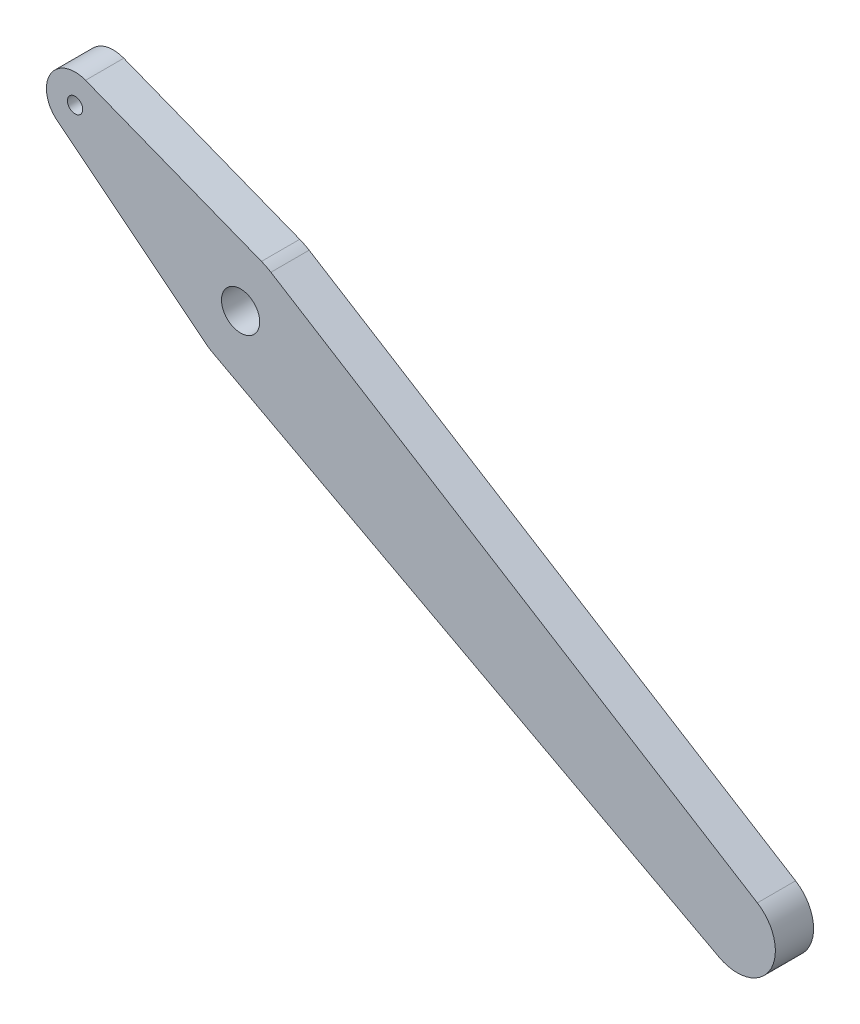
ISO-10303-21;
HEADER;
FILE_DESCRIPTION(('STEP AP214'),'2;1');
FILE_NAME('part.step','',(''),(''),'','','');
FILE_SCHEMA(('AUTOMOTIVE_DESIGN { 1 0 10303 214 1 1 1 1 }'));
ENDSEC;
DATA;
#1=APPLICATION_CONTEXT('core data for automotive mechanical design processes');
#2=APPLICATION_PROTOCOL_DEFINITION('international standard','automotive_design',2000,#1);
#3=PRODUCT_CONTEXT('',#1,'mechanical');
#4=PRODUCT('Part','Part','',(#3));
#5=PRODUCT_RELATED_PRODUCT_CATEGORY('part','',(#4));
#6=PRODUCT_DEFINITION_FORMATION('','',#4);
#7=PRODUCT_DEFINITION_CONTEXT('part definition',#1,'design');
#8=PRODUCT_DEFINITION('design','',#6,#7);
#9=PRODUCT_DEFINITION_SHAPE('','',#8);
#10=(LENGTH_UNIT() NAMED_UNIT(*) SI_UNIT(.MILLI.,.METRE.));
#11=(NAMED_UNIT(*) PLANE_ANGLE_UNIT() SI_UNIT($,.RADIAN.));
#12=(NAMED_UNIT(*) SI_UNIT($,.STERADIAN.) SOLID_ANGLE_UNIT());
#13=UNCERTAINTY_MEASURE_WITH_UNIT(LENGTH_MEASURE(1.E-05),#10,'distance_accuracy_value','');
#14=(GEOMETRIC_REPRESENTATION_CONTEXT(3) GLOBAL_UNCERTAINTY_ASSIGNED_CONTEXT((#13)) GLOBAL_UNIT_ASSIGNED_CONTEXT((#10,
#11,#12)) REPRESENTATION_CONTEXT('',''));
#15=CARTESIAN_POINT('',(0.,0.,0.));
#16=DIRECTION('',(0.,0.,1.));
#17=DIRECTION('',(1.,0.,0.));
#18=AXIS2_PLACEMENT_3D('',#15,#16,#17);
#19=CARTESIAN_POINT('',(-43.3012701892221,24.9999999999997,5.));
#20=DIRECTION('',(0.,0.,-1.));
#21=DIRECTION('',(-1.,0.,0.));
#22=AXIS2_PLACEMENT_3D('',#19,#20,#21);
#23=CYLINDRICAL_SURFACE('',#22,7.5);
#24=CARTESIAN_POINT('',(-43.3012701892221,24.9999999999997,-5.));
#25=DIRECTION('',(0.,0.,1.));
#26=DIRECTION('',(1.,0.,0.));
#27=AXIS2_PLACEMENT_3D('',#24,#25,#26);
#28=CIRCLE('',#27,7.5);
#29=CARTESIAN_POINT('',(-40.5679762809887,31.9842039210786,-5.));
#30=VERTEX_POINT('',#29);
#31=CARTESIAN_POINT('',(-47.9831212559705,19.1407960789208,-5.));
#32=VERTEX_POINT('',#31);
#33=EDGE_CURVE('E131',#30,#32,#28,.T.);
#34=ORIENTED_EDGE('',*,*,#33,.T.);
#35=DIRECTION('',(0.,0.,-1.));
#36=VECTOR('',#35,1.);
#37=CARTESIAN_POINT('',(-47.9831212559705,19.1407960789208,5.));
#38=LINE('',#37,#36);
#39=CARTESIAN_POINT('',(-47.9831212559705,19.1407960789208,5.));
#40=VERTEX_POINT('',#39);
#41=EDGE_CURVE('E11',#40,#32,#38,.T.);
#42=ORIENTED_EDGE('',*,*,#41,.F.);
#43=CARTESIAN_POINT('',(-43.3012701892221,24.9999999999997,5.));
#44=DIRECTION('',(0.,0.,1.));
#45=DIRECTION('',(1.,0.,0.));
#46=AXIS2_PLACEMENT_3D('',#43,#44,#45);
#47=CIRCLE('',#46,7.5);
#48=CARTESIAN_POINT('',(-40.5679762809887,31.9842039210786,5.));
#49=VERTEX_POINT('',#48);
#50=EDGE_CURVE('E148',#49,#40,#47,.T.);
#51=ORIENTED_EDGE('',*,*,#50,.F.);
#52=DIRECTION('',(0.,0.,-1.));
#53=VECTOR('',#52,1.);
#54=CARTESIAN_POINT('',(-40.5679762809887,31.9842039210786,5.));
#55=LINE('',#54,#53);
#56=EDGE_CURVE('E48',#49,#30,#55,.T.);
#57=ORIENTED_EDGE('',*,*,#56,.T.);
#58=EDGE_LOOP('',(#34,#42,#51,#57));
#59=FACE_BOUND('',#58,.T.);
#60=ADVANCED_FACE('F32',(#59),#23,.T.);
#61=CARTESIAN_POINT('',(-9.36370213349686,-11.7184078421578,5.));
#62=DIRECTION('',(0.624246808899791,0.781227189477189,0.));
#63=DIRECTION('',(-0.781227189477189,0.624246808899791,0.));
#64=AXIS2_PLACEMENT_3D('',#61,#62,#63);
#65=PLANE('',#64);
#66=DIRECTION('',(0.781227189477189,-0.624246808899791,0.));
#67=VECTOR('',#66,1.);
#68=CARTESIAN_POINT('',(-9.36370213349686,-11.7184078421578,-5.));
#69=LINE('',#68,#67);
#70=CARTESIAN_POINT('',(-9.36370213349686,-11.7184078421578,-5.));
#71=VERTEX_POINT('',#70);
#72=EDGE_CURVE('E133',#32,#71,#69,.T.);
#73=ORIENTED_EDGE('',*,*,#72,.T.);
#74=DIRECTION('',(0.,0.,-1.));
#75=VECTOR('',#74,1.);
#76=CARTESIAN_POINT('',(-9.36370213349686,-11.7184078421578,5.));
#77=LINE('',#76,#75);
#78=CARTESIAN_POINT('',(-9.36370213349686,-11.7184078421578,5.));
#79=VERTEX_POINT('',#78);
#80=EDGE_CURVE('E40',#79,#71,#77,.T.);
#81=ORIENTED_EDGE('',*,*,#80,.F.);
#82=DIRECTION('',(0.781227189477189,-0.624246808899791,0.));
#83=VECTOR('',#82,1.);
#84=CARTESIAN_POINT('',(-9.36370213349686,-11.7184078421578,5.));
#85=LINE('',#84,#83);
#86=EDGE_CURVE('E87',#40,#79,#85,.T.);
#87=ORIENTED_EDGE('',*,*,#86,.F.);
#88=ORIENTED_EDGE('',*,*,#41,.T.);
#89=EDGE_LOOP('',(#73,#81,#87,#88));
#90=FACE_BOUND('',#89,.T.);
#91=ADVANCED_FACE('F185',(#90),#65,.F.);
#92=CARTESIAN_POINT('',(0.,0.,5.));
#93=DIRECTION('',(0.,0.,-1.));
#94=DIRECTION('',(-1.,0.,0.));
#95=AXIS2_PLACEMENT_3D('',#92,#93,#94);
#96=CYLINDRICAL_SURFACE('',#95,15.);
#97=CARTESIAN_POINT('',(0.,0.,-5.));
#98=DIRECTION('',(0.,0.,1.));
#99=DIRECTION('',(1.,0.,0.));
#100=AXIS2_PLACEMENT_3D('',#97,#98,#99);
#101=CIRCLE('',#100,15.);
#102=CARTESIAN_POINT('',(-7.06281947339017,-13.2331621725988,-5.));
#103=VERTEX_POINT('',#102);
#104=EDGE_CURVE('E136',#71,#103,#101,.T.);
#105=ORIENTED_EDGE('',*,*,#104,.T.);
#106=DIRECTION('',(0.,0.,-1.));
#107=VECTOR('',#106,1.);
#108=CARTESIAN_POINT('',(-7.06281947339017,-13.2331621725988,5.));
#109=LINE('',#108,#107);
#110=CARTESIAN_POINT('',(-7.06281947339017,-13.2331621725988,5.));
#111=VERTEX_POINT('',#110);
#112=EDGE_CURVE('E155',#111,#103,#109,.T.);
#113=ORIENTED_EDGE('',*,*,#112,.F.);
#114=CARTESIAN_POINT('',(0.,0.,5.));
#115=DIRECTION('',(0.,0.,1.));
#116=DIRECTION('',(1.,0.,0.));
#117=AXIS2_PLACEMENT_3D('',#114,#115,#116);
#118=CIRCLE('',#117,15.);
#119=EDGE_CURVE('E120',#79,#111,#118,.T.);
#120=ORIENTED_EDGE('',*,*,#119,.F.);
#121=ORIENTED_EDGE('',*,*,#80,.T.);
#122=EDGE_LOOP('',(#105,#113,#120,#121));
#123=FACE_BOUND('',#122,.T.);
#124=ADVANCED_FACE('F161',(#123),#96,.T.);
#125=CARTESIAN_POINT('',(-7.06281947339017,-13.2331621725988,5.));
#126=DIRECTION('',(0.470854631559345,0.882210811506589,0.));
#127=DIRECTION('',(-0.882210811506589,0.470854631559345,0.));
#128=AXIS2_PLACEMENT_3D('',#125,#126,#127);
#129=PLANE('',#128);
#130=DIRECTION('',(0.882210811506589,-0.470854631559345,0.));
#131=VECTOR('',#130,1.);
#132=CARTESIAN_POINT('',(-7.06281947339017,-13.2331621725988,-5.));
#133=LINE('',#132,#131);
#134=CARTESIAN_POINT('',(125.195264252073,-83.8221081150649,-5.));
#135=VERTEX_POINT('',#134);
#136=EDGE_CURVE('E138',#103,#135,#133,.T.);
#137=ORIENTED_EDGE('',*,*,#136,.T.);
#138=DIRECTION('',(0.,0.,-1.));
#139=VECTOR('',#138,1.);
#140=CARTESIAN_POINT('',(125.195264252073,-83.8221081150649,5.));
#141=LINE('',#140,#139);
#142=CARTESIAN_POINT('',(125.195264252073,-83.8221081150649,5.));
#143=VERTEX_POINT('',#142);
#144=EDGE_CURVE('E152',#143,#135,#141,.T.);
#145=ORIENTED_EDGE('',*,*,#144,.F.);
#146=DIRECTION('',(0.882210811506589,-0.470854631559345,0.));
#147=VECTOR('',#146,1.);
#148=CARTESIAN_POINT('',(-7.06281947339017,-13.2331621725988,5.));
#149=LINE('',#148,#147);
#150=EDGE_CURVE('E126',#111,#143,#149,.T.);
#151=ORIENTED_EDGE('',*,*,#150,.F.);
#152=ORIENTED_EDGE('',*,*,#112,.T.);
#153=EDGE_LOOP('',(#137,#145,#151,#152));
#154=FACE_BOUND('',#153,.T.);
#155=ADVANCED_FACE('F169',(#154),#129,.F.);
#156=CARTESIAN_POINT('',(129.903810567666,-74.9999999999992,5.));
#157=DIRECTION('',(0.,0.,-1.));
#158=DIRECTION('',(-1.,0.,0.));
#159=AXIS2_PLACEMENT_3D('',#156,#157,#158);
#160=CYLINDRICAL_SURFACE('',#159,9.99999999999969);
#161=CARTESIAN_POINT('',(129.903810567666,-74.9999999999992,-5.));
#162=DIRECTION('',(0.,0.,1.));
#163=DIRECTION('',(1.,0.,0.));
#164=AXIS2_PLACEMENT_3D('',#161,#162,#163);
#165=CIRCLE('',#164,9.99999999999969);
#166=CARTESIAN_POINT('',(135.189707152449,-66.5112252182668,-5.));
#167=VERTEX_POINT('',#166);
#168=EDGE_CURVE('E141',#135,#167,#165,.T.);
#169=ORIENTED_EDGE('',*,*,#168,.T.);
#170=DIRECTION('',(0.,0.,-1.));
#171=VECTOR('',#170,1.);
#172=CARTESIAN_POINT('',(135.189707152449,-66.5112252182668,5.));
#173=LINE('',#172,#171);
#174=CARTESIAN_POINT('',(135.189707152449,-66.5112252182668,5.));
#175=VERTEX_POINT('',#174);
#176=EDGE_CURVE('E112',#175,#167,#173,.T.);
#177=ORIENTED_EDGE('',*,*,#176,.F.);
#178=CARTESIAN_POINT('',(129.903810567666,-74.9999999999992,5.));
#179=DIRECTION('',(0.,0.,1.));
#180=DIRECTION('',(1.,0.,0.));
#181=AXIS2_PLACEMENT_3D('',#178,#179,#180);
#182=CIRCLE('',#181,9.99999999999969);
#183=EDGE_CURVE('E123',#143,#175,#182,.T.);
#184=ORIENTED_EDGE('',*,*,#183,.F.);
#185=ORIENTED_EDGE('',*,*,#144,.T.);
#186=EDGE_LOOP('',(#169,#177,#184,#185));
#187=FACE_BOUND('',#186,.T.);
#188=ADVANCED_FACE('F172',(#187),#160,.T.);
#189=CARTESIAN_POINT('',(7.92884487717462,12.7331621725988,5.));
#190=DIRECTION('',(0.528589658478308,0.848877478173256,0.));
#191=DIRECTION('',(-0.848877478173256,0.528589658478308,0.));
#192=AXIS2_PLACEMENT_3D('',#189,#190,#191);
#193=PLANE('',#192);
#194=DIRECTION('',(0.848877478173256,-0.528589658478308,0.));
#195=VECTOR('',#194,1.);
#196=CARTESIAN_POINT('',(7.92884487717462,12.7331621725988,-5.));
#197=LINE('',#196,#195);
#198=CARTESIAN_POINT('',(7.92884487717462,12.7331621725988,-5.));
#199=VERTEX_POINT('',#198);
#200=EDGE_CURVE('E109',#199,#167,#197,.T.);
#201=ORIENTED_EDGE('',*,*,#200,.F.);
#202=DIRECTION('',(0.,0.,-1.));
#203=VECTOR('',#202,1.);
#204=CARTESIAN_POINT('',(7.92884487717462,12.7331621725988,5.));
#205=LINE('',#204,#203);
#206=CARTESIAN_POINT('',(7.92884487717462,12.7331621725988,5.));
#207=VERTEX_POINT('',#206);
#208=EDGE_CURVE('E103',#207,#199,#205,.T.);
#209=ORIENTED_EDGE('',*,*,#208,.F.);
#210=DIRECTION('',(0.848877478173256,-0.528589658478308,0.));
#211=VECTOR('',#210,1.);
#212=CARTESIAN_POINT('',(7.92884487717462,12.7331621725988,5.));
#213=LINE('',#212,#211);
#214=EDGE_CURVE('E107',#207,#175,#213,.T.);
#215=ORIENTED_EDGE('',*,*,#214,.T.);
#216=ORIENTED_EDGE('',*,*,#176,.T.);
#217=EDGE_LOOP('',(#201,#209,#215,#216));
#218=FACE_BOUND('',#217,.T.);
#219=ADVANCED_FACE('F105',(#218),#193,.T.);
#220=CARTESIAN_POINT('',(5.46658781646687,13.9684078421578,-5.));
#221=VERTEX_POINT('',#220);
#222=EDGE_CURVE('E139',#199,#221,#101,.T.);
#223=ORIENTED_EDGE('',*,*,#222,.T.);
#224=DIRECTION('',(0.,0.,-1.));
#225=VECTOR('',#224,1.);
#226=CARTESIAN_POINT('',(5.46658781646687,13.9684078421578,5.));
#227=LINE('',#226,#225);
#228=CARTESIAN_POINT('',(5.46658781646687,13.9684078421578,5.));
#229=VERTEX_POINT('',#228);
#230=EDGE_CURVE('E75',#229,#221,#227,.T.);
#231=ORIENTED_EDGE('',*,*,#230,.F.);
#232=EDGE_CURVE('E114',#207,#229,#118,.T.);
#233=ORIENTED_EDGE('',*,*,#232,.F.);
#234=ORIENTED_EDGE('',*,*,#208,.T.);
#235=EDGE_LOOP('',(#223,#231,#233,#234));
#236=FACE_BOUND('',#235,.T.);
#237=ADVANCED_FACE('F115',(#236),#96,.T.);
#238=CARTESIAN_POINT('',(5.46658781646687,13.9684078421578,5.));
#239=DIRECTION('',(0.364439187764458,0.931227189477188,0.));
#240=DIRECTION('',(-0.931227189477188,0.364439187764458,0.));
#241=AXIS2_PLACEMENT_3D('',#238,#239,#240);
#242=PLANE('',#241);
#243=DIRECTION('',(0.931227189477188,-0.364439187764458,0.));
#244=VECTOR('',#243,1.);
#245=CARTESIAN_POINT('',(5.46658781646687,13.9684078421578,-5.));
#246=LINE('',#245,#244);
#247=EDGE_CURVE('E145',#30,#221,#246,.T.);
#248=ORIENTED_EDGE('',*,*,#247,.F.);
#249=ORIENTED_EDGE('',*,*,#56,.F.);
#250=DIRECTION('',(0.931227189477188,-0.364439187764458,0.));
#251=VECTOR('',#250,1.);
#252=CARTESIAN_POINT('',(5.46658781646687,13.9684078421578,5.));
#253=LINE('',#252,#251);
#254=EDGE_CURVE('E118',#49,#229,#253,.T.);
#255=ORIENTED_EDGE('',*,*,#254,.T.);
#256=ORIENTED_EDGE('',*,*,#230,.T.);
#257=EDGE_LOOP('',(#248,#249,#255,#256));
#258=FACE_BOUND('',#257,.T.);
#259=ADVANCED_FACE('F173',(#258),#242,.T.);
#260=CARTESIAN_POINT('',(0.,0.,5.));
#261=DIRECTION('',(0.,0.,1.));
#262=DIRECTION('',(1.,0.,0.));
#263=AXIS2_PLACEMENT_3D('',#260,#261,#262);
#264=PLANE('',#263);
#265=CARTESIAN_POINT('',(-43.3012701892221,24.9999999999997,5.));
#266=DIRECTION('',(0.,0.,1.));
#267=DIRECTION('',(1.,0.,0.));
#268=AXIS2_PLACEMENT_3D('',#265,#266,#267);
#269=CIRCLE('',#268,2.);
#270=CARTESIAN_POINT('',(-41.3012701892221,24.9999999999997,5.));
#271=VERTEX_POINT('',#270);
#272=EDGE_CURVE('E196',#271,#271,#269,.T.);
#273=ORIENTED_EDGE('',*,*,#272,.F.);
#274=EDGE_LOOP('',(#273));
#275=FACE_BOUND('',#274,.T.);
#276=CARTESIAN_POINT('',(0.,0.,5.));
#277=DIRECTION('',(0.,0.,1.));
#278=DIRECTION('',(1.,0.,0.));
#279=AXIS2_PLACEMENT_3D('',#276,#277,#278);
#280=CIRCLE('',#279,5.);
#281=CARTESIAN_POINT('',(5.,0.,5.));
#282=VERTEX_POINT('',#281);
#283=EDGE_CURVE('E197',#282,#282,#280,.T.);
#284=ORIENTED_EDGE('',*,*,#283,.F.);
#285=EDGE_LOOP('',(#284));
#286=FACE_BOUND('',#285,.T.);
#287=ORIENTED_EDGE('',*,*,#50,.T.);
#288=ORIENTED_EDGE('',*,*,#86,.T.);
#289=ORIENTED_EDGE('',*,*,#119,.T.);
#290=ORIENTED_EDGE('',*,*,#150,.T.);
#291=ORIENTED_EDGE('',*,*,#183,.T.);
#292=ORIENTED_EDGE('',*,*,#214,.F.);
#293=ORIENTED_EDGE('',*,*,#232,.T.);
#294=ORIENTED_EDGE('',*,*,#254,.F.);
#295=EDGE_LOOP('',(#287,#288,#289,#290,#291,#292,#293,#294));
#296=FACE_BOUND('',#295,.T.);
#297=ADVANCED_FACE('F121',(#275,#286,#296),#264,.T.);
#298=CARTESIAN_POINT('',(0.,0.,-5.));
#299=DIRECTION('',(0.,0.,1.));
#300=DIRECTION('',(1.,0.,0.));
#301=AXIS2_PLACEMENT_3D('',#298,#299,#300);
#302=PLANE('',#301);
#303=CARTESIAN_POINT('',(-43.3012701892221,24.9999999999997,-5.));
#304=DIRECTION('',(0.,0.,1.));
#305=DIRECTION('',(1.,0.,0.));
#306=AXIS2_PLACEMENT_3D('',#303,#304,#305);
#307=CIRCLE('',#306,2.);
#308=CARTESIAN_POINT('',(-41.3012701892221,24.9999999999997,-5.));
#309=VERTEX_POINT('',#308);
#310=EDGE_CURVE('E134',#309,#309,#307,.T.);
#311=ORIENTED_EDGE('',*,*,#310,.T.);
#312=EDGE_LOOP('',(#311));
#313=FACE_BOUND('',#312,.T.);
#314=CARTESIAN_POINT('',(0.,0.,-5.));
#315=DIRECTION('',(0.,0.,1.));
#316=DIRECTION('',(1.,0.,0.));
#317=AXIS2_PLACEMENT_3D('',#314,#315,#316);
#318=CIRCLE('',#317,5.);
#319=CARTESIAN_POINT('',(5.,0.,-5.));
#320=VERTEX_POINT('',#319);
#321=EDGE_CURVE('E193',#320,#320,#318,.T.);
#322=ORIENTED_EDGE('',*,*,#321,.T.);
#323=EDGE_LOOP('',(#322));
#324=FACE_BOUND('',#323,.T.);
#325=ORIENTED_EDGE('',*,*,#33,.F.);
#326=ORIENTED_EDGE('',*,*,#247,.T.);
#327=ORIENTED_EDGE('',*,*,#222,.F.);
#328=ORIENTED_EDGE('',*,*,#200,.T.);
#329=ORIENTED_EDGE('',*,*,#168,.F.);
#330=ORIENTED_EDGE('',*,*,#136,.F.);
#331=ORIENTED_EDGE('',*,*,#104,.F.);
#332=ORIENTED_EDGE('',*,*,#72,.F.);
#333=EDGE_LOOP('',(#325,#326,#327,#328,#329,#330,#331,#332));
#334=FACE_BOUND('',#333,.T.);
#335=ADVANCED_FACE('F165',(#313,#324,#334),#302,.F.);
#336=CARTESIAN_POINT('',(0.,0.,-5.));
#337=DIRECTION('',(0.,0.,1.));
#338=DIRECTION('',(1.,0.,0.));
#339=AXIS2_PLACEMENT_3D('',#336,#337,#338);
#340=CYLINDRICAL_SURFACE('',#339,5.);
#341=ORIENTED_EDGE('',*,*,#321,.F.);
#342=EDGE_LOOP('',(#341));
#343=FACE_BOUND('',#342,.T.);
#344=ORIENTED_EDGE('',*,*,#283,.T.);
#345=EDGE_LOOP('',(#344));
#346=FACE_BOUND('',#345,.T.);
#347=ADVANCED_FACE('F209',(#343,#346),#340,.F.);
#348=CARTESIAN_POINT('',(-43.3012701892221,24.9999999999997,-5.));
#349=DIRECTION('',(0.,0.,1.));
#350=DIRECTION('',(1.,0.,0.));
#351=AXIS2_PLACEMENT_3D('',#348,#349,#350);
#352=CYLINDRICAL_SURFACE('',#351,2.);
#353=ORIENTED_EDGE('',*,*,#310,.F.);
#354=EDGE_LOOP('',(#353));
#355=FACE_BOUND('',#354,.T.);
#356=ORIENTED_EDGE('',*,*,#272,.T.);
#357=EDGE_LOOP('',(#356));
#358=FACE_BOUND('',#357,.T.);
#359=ADVANCED_FACE('F205',(#355,#358),#352,.F.);
#360=CLOSED_SHELL('',(#60,#91,#124,#155,#188,#219,#237,#259,#297,#335,#347,#359));
#361=MANIFOLD_SOLID_BREP('B2',#360);
#362=ADVANCED_BREP_SHAPE_REPRESENTATION('',(#18,#361),#14);
#363=SHAPE_DEFINITION_REPRESENTATION(#9,#362);
ENDSEC;
END-ISO-10303-21;
